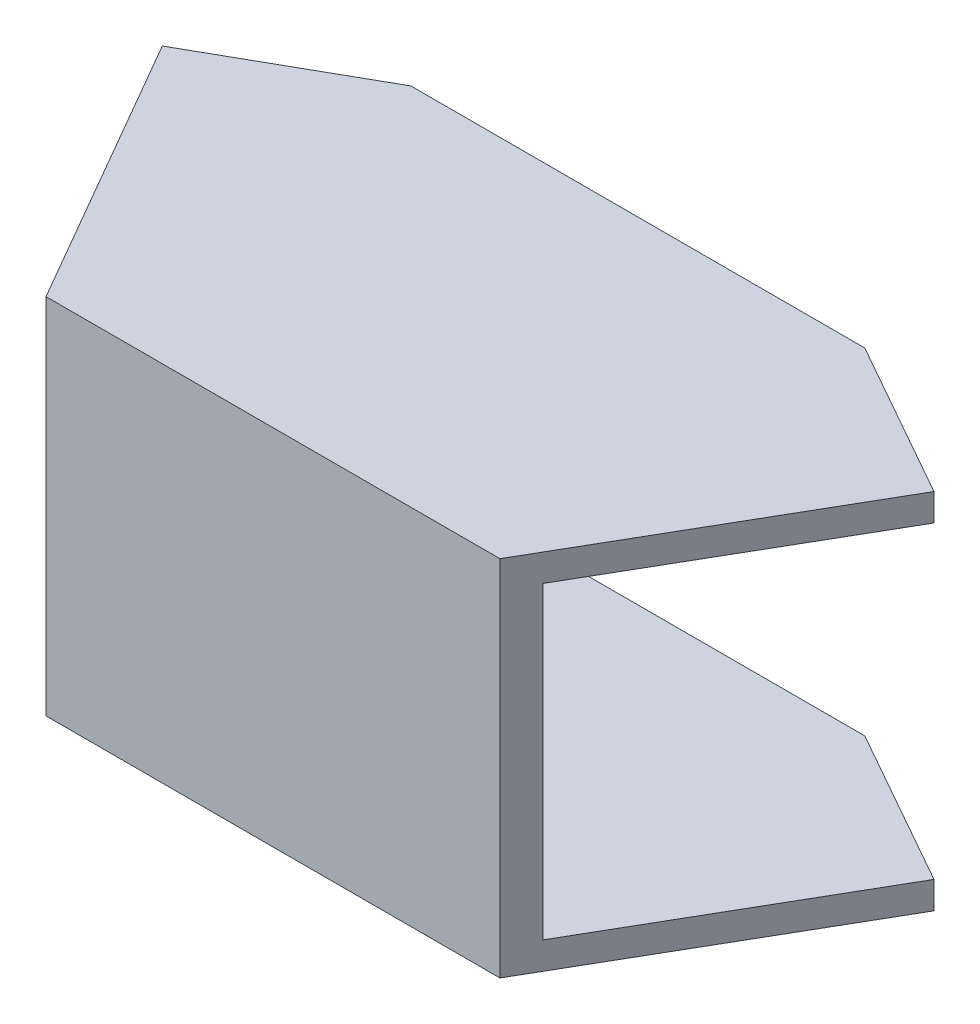
ISO-10303-21;
HEADER;
FILE_DESCRIPTION(('STEP AP214'),'2;1');
FILE_NAME('part.step','',(''),(''),'','','');
FILE_SCHEMA(('AUTOMOTIVE_DESIGN { 1 0 10303 214 1 1 1 1 }'));
ENDSEC;
DATA;
#1=APPLICATION_CONTEXT('core data for automotive mechanical design processes');
#2=APPLICATION_PROTOCOL_DEFINITION('international standard','automotive_design',2000,#1);
#3=PRODUCT_CONTEXT('',#1,'mechanical');
#4=PRODUCT('Part','Part','',(#3));
#5=PRODUCT_RELATED_PRODUCT_CATEGORY('part','',(#4));
#6=PRODUCT_DEFINITION_FORMATION('','',#4);
#7=PRODUCT_DEFINITION_CONTEXT('part definition',#1,'design');
#8=PRODUCT_DEFINITION('design','',#6,#7);
#9=PRODUCT_DEFINITION_SHAPE('','',#8);
#10=(LENGTH_UNIT() NAMED_UNIT(*) SI_UNIT(.MILLI.,.METRE.));
#11=(NAMED_UNIT(*) PLANE_ANGLE_UNIT() SI_UNIT($,.RADIAN.));
#12=(NAMED_UNIT(*) SI_UNIT($,.STERADIAN.) SOLID_ANGLE_UNIT());
#13=UNCERTAINTY_MEASURE_WITH_UNIT(LENGTH_MEASURE(1.E-05),#10,'distance_accuracy_value','');
#14=(GEOMETRIC_REPRESENTATION_CONTEXT(3) GLOBAL_UNCERTAINTY_ASSIGNED_CONTEXT((#13)) GLOBAL_UNIT_ASSIGNED_CONTEXT((#10,
#11,#12)) REPRESENTATION_CONTEXT('',''));
#15=CARTESIAN_POINT('',(0.,0.,0.));
#16=DIRECTION('',(0.,0.,1.));
#17=DIRECTION('',(1.,0.,0.));
#18=AXIS2_PLACEMENT_3D('',#15,#16,#17);
#19=CARTESIAN_POINT('',(-25.,40.,16.7014581939071));
#20=DIRECTION('',(0.866025403784436,0.,-0.500000000000004));
#21=DIRECTION('',(-0.500000000000004,0.,-0.866025403784436));
#22=AXIS2_PLACEMENT_3D('',#19,#20,#21);
#23=PLANE('',#22);
#24=DIRECTION('',(0.500000000000004,0.,0.866025403784436));
#25=VECTOR('',#24,1.);
#26=CARTESIAN_POINT('',(-25.9819435380836,3.,15.0006820957824));
#27=LINE('',#26,#25);
#28=CARTESIAN_POINT('',(-42.5000000000001,3.,-13.6094309385482));
#29=VERTEX_POINT('',#28);
#30=CARTESIAN_POINT('',(-26.7320508075689,3.,13.7014581939071));
#31=VERTEX_POINT('',#30);
#32=EDGE_CURVE('E228',#29,#31,#27,.T.);
#33=ORIENTED_EDGE('',*,*,#32,.F.);
#34=DIRECTION('',(0.,-1.,0.));
#35=VECTOR('',#34,1.);
#36=CARTESIAN_POINT('',(-42.5000000000001,40.,-13.6094309385482));
#37=LINE('',#36,#35);
#38=CARTESIAN_POINT('',(-42.5000000000001,0.,-13.6094309385482));
#39=VERTEX_POINT('',#38);
#40=EDGE_CURVE('E84',#29,#39,#37,.T.);
#41=ORIENTED_EDGE('',*,*,#40,.T.);
#42=DIRECTION('',(0.500000000000004,0.,0.866025403784436));
#43=VECTOR('',#42,1.);
#44=CARTESIAN_POINT('',(-25.,0.,16.7014581939071));
#45=LINE('',#44,#43);
#46=CARTESIAN_POINT('',(-25.,0.,16.7014581939071));
#47=VERTEX_POINT('',#46);
#48=EDGE_CURVE('E133',#39,#47,#45,.T.);
#49=ORIENTED_EDGE('',*,*,#48,.T.);
#50=DIRECTION('',(0.,-1.,0.));
#51=VECTOR('',#50,1.);
#52=CARTESIAN_POINT('',(-25.,40.,16.7014581939071));
#53=LINE('',#52,#51);
#54=CARTESIAN_POINT('',(-25.,40.,16.7014581939071));
#55=VERTEX_POINT('',#54);
#56=EDGE_CURVE('E11',#55,#47,#53,.T.);
#57=ORIENTED_EDGE('',*,*,#56,.F.);
#58=DIRECTION('',(0.500000000000004,0.,0.866025403784436));
#59=VECTOR('',#58,1.);
#60=CARTESIAN_POINT('',(-25.,40.,16.7014581939071));
#61=LINE('',#60,#59);
#62=CARTESIAN_POINT('',(-42.5000000000001,40.,-13.6094309385482));
#63=VERTEX_POINT('',#62);
#64=EDGE_CURVE('E149',#63,#55,#61,.T.);
#65=ORIENTED_EDGE('',*,*,#64,.F.);
#66=CARTESIAN_POINT('',(-42.5000000000001,37.,-13.6094309385482));
#67=VERTEX_POINT('',#66);
#68=EDGE_CURVE('E150',#63,#67,#37,.T.);
#69=ORIENTED_EDGE('',*,*,#68,.T.);
#70=DIRECTION('',(0.500000000000004,0.,0.866025403784436));
#71=VECTOR('',#70,1.);
#72=CARTESIAN_POINT('',(-25.9819435380836,37.,15.0006820957824));
#73=LINE('',#72,#71);
#74=CARTESIAN_POINT('',(-26.7320508075689,37.,13.7014581939071));
#75=VERTEX_POINT('',#74);
#76=EDGE_CURVE('E47',#67,#75,#73,.T.);
#77=ORIENTED_EDGE('',*,*,#76,.T.);
#78=DIRECTION('',(0.,-1.,0.));
#79=VECTOR('',#78,1.);
#80=CARTESIAN_POINT('',(-26.7320508075689,40.,13.7014581939071));
#81=LINE('',#80,#79);
#82=EDGE_CURVE('E136',#75,#31,#81,.T.);
#83=ORIENTED_EDGE('',*,*,#82,.T.);
#84=EDGE_LOOP('',(#33,#41,#49,#57,#65,#69,#77,#83));
#85=FACE_BOUND('',#84,.T.);
#86=ADVANCED_FACE('F33',(#85),#23,.F.);
#87=CARTESIAN_POINT('',(25.,40.,16.7014581939071));
#88=DIRECTION('',(-0.866025403784436,0.,-0.500000000000004));
#89=DIRECTION('',(-0.500000000000004,0.,0.866025403784436));
#90=AXIS2_PLACEMENT_3D('',#87,#88,#89);
#91=PLANE('',#90);
#92=DIRECTION('',(0.500000000000004,0.,-0.866025403784436));
#93=VECTOR('',#92,1.);
#94=CARTESIAN_POINT('',(25.9819435380836,3.,15.0006820957824));
#95=LINE('',#94,#93);
#96=CARTESIAN_POINT('',(26.7320508075689,3.,13.7014581939071));
#97=VERTEX_POINT('',#96);
#98=CARTESIAN_POINT('',(42.5000000000001,3.,-13.6094309385481));
#99=VERTEX_POINT('',#98);
#100=EDGE_CURVE('E179',#97,#99,#95,.T.);
#101=ORIENTED_EDGE('',*,*,#100,.F.);
#102=DIRECTION('',(0.,-1.,0.));
#103=VECTOR('',#102,1.);
#104=CARTESIAN_POINT('',(26.7320508075689,40.,13.7014581939071));
#105=LINE('',#104,#103);
#106=CARTESIAN_POINT('',(26.7320508075689,37.,13.7014581939071));
#107=VERTEX_POINT('',#106);
#108=EDGE_CURVE('E208',#107,#97,#105,.T.);
#109=ORIENTED_EDGE('',*,*,#108,.F.);
#110=DIRECTION('',(0.500000000000004,0.,-0.866025403784436));
#111=VECTOR('',#110,1.);
#112=CARTESIAN_POINT('',(25.9819435380836,37.,15.0006820957824));
#113=LINE('',#112,#111);
#114=CARTESIAN_POINT('',(42.5000000000001,37.,-13.6094309385481));
#115=VERTEX_POINT('',#114);
#116=EDGE_CURVE('E210',#107,#115,#113,.T.);
#117=ORIENTED_EDGE('',*,*,#116,.T.);
#118=DIRECTION('',(0.,-1.,0.));
#119=VECTOR('',#118,1.);
#120=CARTESIAN_POINT('',(42.5000000000001,40.,-13.6094309385481));
#121=LINE('',#120,#119);
#122=CARTESIAN_POINT('',(42.5000000000001,40.,-13.6094309385481));
#123=VERTEX_POINT('',#122);
#124=EDGE_CURVE('E155',#123,#115,#121,.T.);
#125=ORIENTED_EDGE('',*,*,#124,.F.);
#126=DIRECTION('',(0.500000000000004,0.,-0.866025403784436));
#127=VECTOR('',#126,1.);
#128=CARTESIAN_POINT('',(25.,40.,16.7014581939071));
#129=LINE('',#128,#127);
#130=CARTESIAN_POINT('',(25.,40.,16.7014581939071));
#131=VERTEX_POINT('',#130);
#132=EDGE_CURVE('E109',#131,#123,#129,.T.);
#133=ORIENTED_EDGE('',*,*,#132,.F.);
#134=DIRECTION('',(0.,-1.,0.));
#135=VECTOR('',#134,1.);
#136=CARTESIAN_POINT('',(25.,40.,16.7014581939071));
#137=LINE('',#136,#135);
#138=CARTESIAN_POINT('',(25.,0.,16.7014581939071));
#139=VERTEX_POINT('',#138);
#140=EDGE_CURVE('E40',#131,#139,#137,.T.);
#141=ORIENTED_EDGE('',*,*,#140,.T.);
#142=DIRECTION('',(0.500000000000004,0.,-0.866025403784436));
#143=VECTOR('',#142,1.);
#144=CARTESIAN_POINT('',(25.,0.,16.7014581939071));
#145=LINE('',#144,#143);
#146=CARTESIAN_POINT('',(42.5000000000001,0.,-13.6094309385481));
#147=VERTEX_POINT('',#146);
#148=EDGE_CURVE('E138',#139,#147,#145,.T.);
#149=ORIENTED_EDGE('',*,*,#148,.T.);
#150=EDGE_CURVE('E123',#99,#147,#121,.T.);
#151=ORIENTED_EDGE('',*,*,#150,.F.);
#152=EDGE_LOOP('',(#101,#109,#117,#125,#133,#141,#149,#151));
#153=FACE_BOUND('',#152,.T.);
#154=ADVANCED_FACE('F160',(#153),#91,.F.);
#155=CARTESIAN_POINT('',(25.,40.,-23.4878170828097));
#156=DIRECTION('',(-0.491569985837739,0.,0.870838072791656));
#157=DIRECTION('',(0.870838072791656,0.,0.491569985837739));
#158=AXIS2_PLACEMENT_3D('',#155,#156,#157);
#159=PLANE('',#158);
#160=DIRECTION('',(-0.870838072791656,0.,-0.491569985837739));
#161=VECTOR('',#160,1.);
#162=CARTESIAN_POINT('',(16.0956407263695,3.,-28.5141427555044));
#163=LINE('',#162,#161);
#164=CARTESIAN_POINT('',(25.,3.,-23.4878170828097));
#165=VERTEX_POINT('',#164);
#166=EDGE_CURVE('E175',#99,#165,#163,.T.);
#167=ORIENTED_EDGE('',*,*,#166,.F.);
#168=ORIENTED_EDGE('',*,*,#150,.T.);
#169=DIRECTION('',(-0.870838072791656,0.,-0.491569985837739));
#170=VECTOR('',#169,1.);
#171=CARTESIAN_POINT('',(25.,0.,-23.4878170828097));
#172=LINE('',#171,#170);
#173=CARTESIAN_POINT('',(25.,0.,-23.4878170828097));
#174=VERTEX_POINT('',#173);
#175=EDGE_CURVE('E141',#147,#174,#172,.T.);
#176=ORIENTED_EDGE('',*,*,#175,.T.);
#177=DIRECTION('',(0.,-1.,0.));
#178=VECTOR('',#177,1.);
#179=CARTESIAN_POINT('',(25.,40.,-23.4878170828097));
#180=LINE('',#179,#178);
#181=EDGE_CURVE('E124',#165,#174,#180,.T.);
#182=ORIENTED_EDGE('',*,*,#181,.F.);
#183=EDGE_LOOP('',(#167,#168,#176,#182));
#184=FACE_BOUND('',#183,.T.);
#185=ADVANCED_FACE('F171',(#184),#159,.F.);
#186=CARTESIAN_POINT('',(-25.,40.,-23.4878170828097));
#187=DIRECTION('',(0.,0.,1.));
#188=DIRECTION('',(1.,0.,0.));
#189=AXIS2_PLACEMENT_3D('',#186,#187,#188);
#190=PLANE('',#189);
#191=DIRECTION('',(-1.,0.,0.));
#192=VECTOR('',#191,1.);
#193=CARTESIAN_POINT('',(0.,3.,-23.4878170828097));
#194=LINE('',#193,#192);
#195=CARTESIAN_POINT('',(-25.,3.,-23.4878170828097));
#196=VERTEX_POINT('',#195);
#197=EDGE_CURVE('E224',#165,#196,#194,.T.);
#198=ORIENTED_EDGE('',*,*,#197,.F.);
#199=ORIENTED_EDGE('',*,*,#181,.T.);
#200=DIRECTION('',(-1.,0.,0.));
#201=VECTOR('',#200,1.);
#202=CARTESIAN_POINT('',(-25.,0.,-23.4878170828097));
#203=LINE('',#202,#201);
#204=CARTESIAN_POINT('',(-25.,0.,-23.4878170828097));
#205=VERTEX_POINT('',#204);
#206=EDGE_CURVE('E144',#174,#205,#203,.T.);
#207=ORIENTED_EDGE('',*,*,#206,.T.);
#208=DIRECTION('',(0.,-1.,0.));
#209=VECTOR('',#208,1.);
#210=CARTESIAN_POINT('',(-25.,40.,-23.4878170828097));
#211=LINE('',#210,#209);
#212=EDGE_CURVE('E153',#196,#205,#211,.T.);
#213=ORIENTED_EDGE('',*,*,#212,.F.);
#214=EDGE_LOOP('',(#198,#199,#207,#213));
#215=FACE_BOUND('',#214,.T.);
#216=ADVANCED_FACE('F245',(#215),#190,.F.);
#217=CARTESIAN_POINT('',(-42.5000000000001,40.,-13.6094309385482));
#218=DIRECTION('',(0.491569985837739,0.,0.870838072791656));
#219=DIRECTION('',(0.870838072791656,0.,-0.491569985837739));
#220=AXIS2_PLACEMENT_3D('',#217,#218,#219);
#221=PLANE('',#220);
#222=DIRECTION('',(-0.870838072791656,0.,0.491569985837739));
#223=VECTOR('',#222,1.);
#224=CARTESIAN_POINT('',(-16.0956407263695,3.,-28.5141427555044));
#225=LINE('',#224,#223);
#226=EDGE_CURVE('E226',#196,#29,#225,.T.);
#227=ORIENTED_EDGE('',*,*,#226,.F.);
#228=ORIENTED_EDGE('',*,*,#212,.T.);
#229=DIRECTION('',(-0.870838072791656,0.,0.491569985837739));
#230=VECTOR('',#229,1.);
#231=CARTESIAN_POINT('',(-42.5000000000001,0.,-13.6094309385482));
#232=LINE('',#231,#230);
#233=EDGE_CURVE('E147',#205,#39,#232,.T.);
#234=ORIENTED_EDGE('',*,*,#233,.T.);
#235=ORIENTED_EDGE('',*,*,#40,.F.);
#236=EDGE_LOOP('',(#227,#228,#234,#235));
#237=FACE_BOUND('',#236,.T.);
#238=ADVANCED_FACE('F239',(#237),#221,.F.);
#239=CARTESIAN_POINT('',(-25.,40.,16.7014581939071));
#240=DIRECTION('',(0.,0.,-1.));
#241=DIRECTION('',(-1.,0.,0.));
#242=AXIS2_PLACEMENT_3D('',#239,#240,#241);
#243=PLANE('',#242);
#244=DIRECTION('',(1.,0.,0.));
#245=VECTOR('',#244,1.);
#246=CARTESIAN_POINT('',(-25.,0.,16.7014581939071));
#247=LINE('',#246,#245);
#248=EDGE_CURVE('E135',#47,#139,#247,.T.);
#249=ORIENTED_EDGE('',*,*,#248,.T.);
#250=ORIENTED_EDGE('',*,*,#140,.F.);
#251=DIRECTION('',(1.,0.,0.));
#252=VECTOR('',#251,1.);
#253=CARTESIAN_POINT('',(-25.,40.,16.7014581939071));
#254=LINE('',#253,#252);
#255=EDGE_CURVE('E92',#55,#131,#254,.T.);
#256=ORIENTED_EDGE('',*,*,#255,.F.);
#257=ORIENTED_EDGE('',*,*,#56,.T.);
#258=EDGE_LOOP('',(#249,#250,#256,#257));
#259=FACE_BOUND('',#258,.T.);
#260=ADVANCED_FACE('F237',(#259),#243,.F.);
#261=ORIENTED_EDGE('',*,*,#124,.T.);
#262=DIRECTION('',(-0.870838072791656,0.,-0.491569985837739));
#263=VECTOR('',#262,1.);
#264=CARTESIAN_POINT('',(16.0956407263695,37.,-28.5141427555044));
#265=LINE('',#264,#263);
#266=CARTESIAN_POINT('',(25.,37.,-23.4878170828097));
#267=VERTEX_POINT('',#266);
#268=EDGE_CURVE('E120',#115,#267,#265,.T.);
#269=ORIENTED_EDGE('',*,*,#268,.T.);
#270=CARTESIAN_POINT('',(25.,40.,-23.4878170828097));
#271=VERTEX_POINT('',#270);
#272=EDGE_CURVE('E116',#271,#267,#180,.T.);
#273=ORIENTED_EDGE('',*,*,#272,.F.);
#274=DIRECTION('',(-0.870838072791656,0.,-0.491569985837739));
#275=VECTOR('',#274,1.);
#276=CARTESIAN_POINT('',(25.,40.,-23.4878170828097));
#277=LINE('',#276,#275);
#278=EDGE_CURVE('E102',#123,#271,#277,.T.);
#279=ORIENTED_EDGE('',*,*,#278,.F.);
#280=EDGE_LOOP('',(#261,#269,#273,#279));
#281=FACE_BOUND('',#280,.T.);
#282=ADVANCED_FACE('F117',(#281),#159,.F.);
#283=ORIENTED_EDGE('',*,*,#272,.T.);
#284=DIRECTION('',(-1.,0.,0.));
#285=VECTOR('',#284,1.);
#286=CARTESIAN_POINT('',(0.,37.,-23.4878170828097));
#287=LINE('',#286,#285);
#288=CARTESIAN_POINT('',(-25.,37.,-23.4878170828097));
#289=VERTEX_POINT('',#288);
#290=EDGE_CURVE('E217',#267,#289,#287,.T.);
#291=ORIENTED_EDGE('',*,*,#290,.T.);
#292=CARTESIAN_POINT('',(-25.,40.,-23.4878170828097));
#293=VERTEX_POINT('',#292);
#294=EDGE_CURVE('E128',#293,#289,#211,.T.);
#295=ORIENTED_EDGE('',*,*,#294,.F.);
#296=DIRECTION('',(-1.,0.,0.));
#297=VECTOR('',#296,1.);
#298=CARTESIAN_POINT('',(-25.,40.,-23.4878170828097));
#299=LINE('',#298,#297);
#300=EDGE_CURVE('E106',#271,#293,#299,.T.);
#301=ORIENTED_EDGE('',*,*,#300,.F.);
#302=EDGE_LOOP('',(#283,#291,#295,#301));
#303=FACE_BOUND('',#302,.T.);
#304=ADVANCED_FACE('F126',(#303),#190,.F.);
#305=ORIENTED_EDGE('',*,*,#294,.T.);
#306=DIRECTION('',(-0.870838072791656,0.,0.491569985837739));
#307=VECTOR('',#306,1.);
#308=CARTESIAN_POINT('',(-16.0956407263695,37.,-28.5141427555044));
#309=LINE('',#308,#307);
#310=EDGE_CURVE('E214',#289,#67,#309,.T.);
#311=ORIENTED_EDGE('',*,*,#310,.T.);
#312=ORIENTED_EDGE('',*,*,#68,.F.);
#313=DIRECTION('',(-0.870838072791656,0.,0.491569985837739));
#314=VECTOR('',#313,1.);
#315=CARTESIAN_POINT('',(-42.5000000000001,40.,-13.6094309385482));
#316=LINE('',#315,#314);
#317=EDGE_CURVE('E56',#293,#63,#316,.T.);
#318=ORIENTED_EDGE('',*,*,#317,.F.);
#319=EDGE_LOOP('',(#305,#311,#312,#318));
#320=FACE_BOUND('',#319,.T.);
#321=ADVANCED_FACE('F248',(#320),#221,.F.);
#322=CARTESIAN_POINT('',(0.,40.,0.));
#323=DIRECTION('',(0.,-1.,0.));
#324=DIRECTION('',(0.,0.,-1.));
#325=AXIS2_PLACEMENT_3D('',#322,#323,#324);
#326=PLANE('',#325);
#327=ORIENTED_EDGE('',*,*,#64,.T.);
#328=ORIENTED_EDGE('',*,*,#255,.T.);
#329=ORIENTED_EDGE('',*,*,#132,.T.);
#330=ORIENTED_EDGE('',*,*,#278,.T.);
#331=ORIENTED_EDGE('',*,*,#300,.T.);
#332=ORIENTED_EDGE('',*,*,#317,.T.);
#333=EDGE_LOOP('',(#327,#328,#329,#330,#331,#332));
#334=FACE_BOUND('',#333,.T.);
#335=ADVANCED_FACE('F104',(#334),#326,.F.);
#336=CARTESIAN_POINT('',(0.,0.,0.));
#337=DIRECTION('',(0.,-1.,0.));
#338=DIRECTION('',(0.,0.,-1.));
#339=AXIS2_PLACEMENT_3D('',#336,#337,#338);
#340=PLANE('',#339);
#341=ORIENTED_EDGE('',*,*,#48,.F.);
#342=ORIENTED_EDGE('',*,*,#233,.F.);
#343=ORIENTED_EDGE('',*,*,#206,.F.);
#344=ORIENTED_EDGE('',*,*,#175,.F.);
#345=ORIENTED_EDGE('',*,*,#148,.F.);
#346=ORIENTED_EDGE('',*,*,#248,.F.);
#347=EDGE_LOOP('',(#341,#342,#343,#344,#345,#346));
#348=FACE_BOUND('',#347,.T.);
#349=ADVANCED_FACE('F165',(#348),#340,.T.);
#350=CARTESIAN_POINT('',(-25.,40.,13.7014581939071));
#351=DIRECTION('',(0.,0.,-1.));
#352=DIRECTION('',(-1.,0.,0.));
#353=AXIS2_PLACEMENT_3D('',#350,#351,#352);
#354=PLANE('',#353);
#355=DIRECTION('',(1.,0.,0.));
#356=VECTOR('',#355,1.);
#357=CARTESIAN_POINT('',(0.,3.,13.7014581939071));
#358=LINE('',#357,#356);
#359=EDGE_CURVE('E222',#31,#97,#358,.T.);
#360=ORIENTED_EDGE('',*,*,#359,.F.);
#361=ORIENTED_EDGE('',*,*,#82,.F.);
#362=DIRECTION('',(1.,0.,0.));
#363=VECTOR('',#362,1.);
#364=CARTESIAN_POINT('',(0.,37.,13.7014581939071));
#365=LINE('',#364,#363);
#366=EDGE_CURVE('E206',#75,#107,#365,.T.);
#367=ORIENTED_EDGE('',*,*,#366,.T.);
#368=ORIENTED_EDGE('',*,*,#108,.T.);
#369=EDGE_LOOP('',(#360,#361,#367,#368));
#370=FACE_BOUND('',#369,.T.);
#371=ADVANCED_FACE('F207',(#370),#354,.T.);
#372=CARTESIAN_POINT('',(0.,37.,0.));
#373=DIRECTION('',(0.,-1.,0.));
#374=DIRECTION('',(0.,0.,-1.));
#375=AXIS2_PLACEMENT_3D('',#372,#373,#374);
#376=PLANE('',#375);
#377=ORIENTED_EDGE('',*,*,#76,.F.);
#378=ORIENTED_EDGE('',*,*,#310,.F.);
#379=ORIENTED_EDGE('',*,*,#290,.F.);
#380=ORIENTED_EDGE('',*,*,#268,.F.);
#381=ORIENTED_EDGE('',*,*,#116,.F.);
#382=ORIENTED_EDGE('',*,*,#366,.F.);
#383=EDGE_LOOP('',(#377,#378,#379,#380,#381,#382));
#384=FACE_BOUND('',#383,.T.);
#385=ADVANCED_FACE('F212',(#384),#376,.T.);
#386=CARTESIAN_POINT('',(0.,3.,0.));
#387=DIRECTION('',(0.,-1.,0.));
#388=DIRECTION('',(0.,0.,-1.));
#389=AXIS2_PLACEMENT_3D('',#386,#387,#388);
#390=PLANE('',#389);
#391=ORIENTED_EDGE('',*,*,#32,.T.);
#392=ORIENTED_EDGE('',*,*,#359,.T.);
#393=ORIENTED_EDGE('',*,*,#100,.T.);
#394=ORIENTED_EDGE('',*,*,#166,.T.);
#395=ORIENTED_EDGE('',*,*,#197,.T.);
#396=ORIENTED_EDGE('',*,*,#226,.T.);
#397=EDGE_LOOP('',(#391,#392,#393,#394,#395,#396));
#398=FACE_BOUND('',#397,.T.);
#399=ADVANCED_FACE('F266',(#398),#390,.F.);
#400=CLOSED_SHELL('',(#86,#154,#185,#216,#238,#260,#282,#304,#321,#335,#349,#371,#385,#399));
#401=MANIFOLD_SOLID_BREP('B2',#400);
#402=ADVANCED_BREP_SHAPE_REPRESENTATION('',(#18,#401),#14);
#403=SHAPE_DEFINITION_REPRESENTATION(#9,#402);
ENDSEC;
END-ISO-10303-21;
